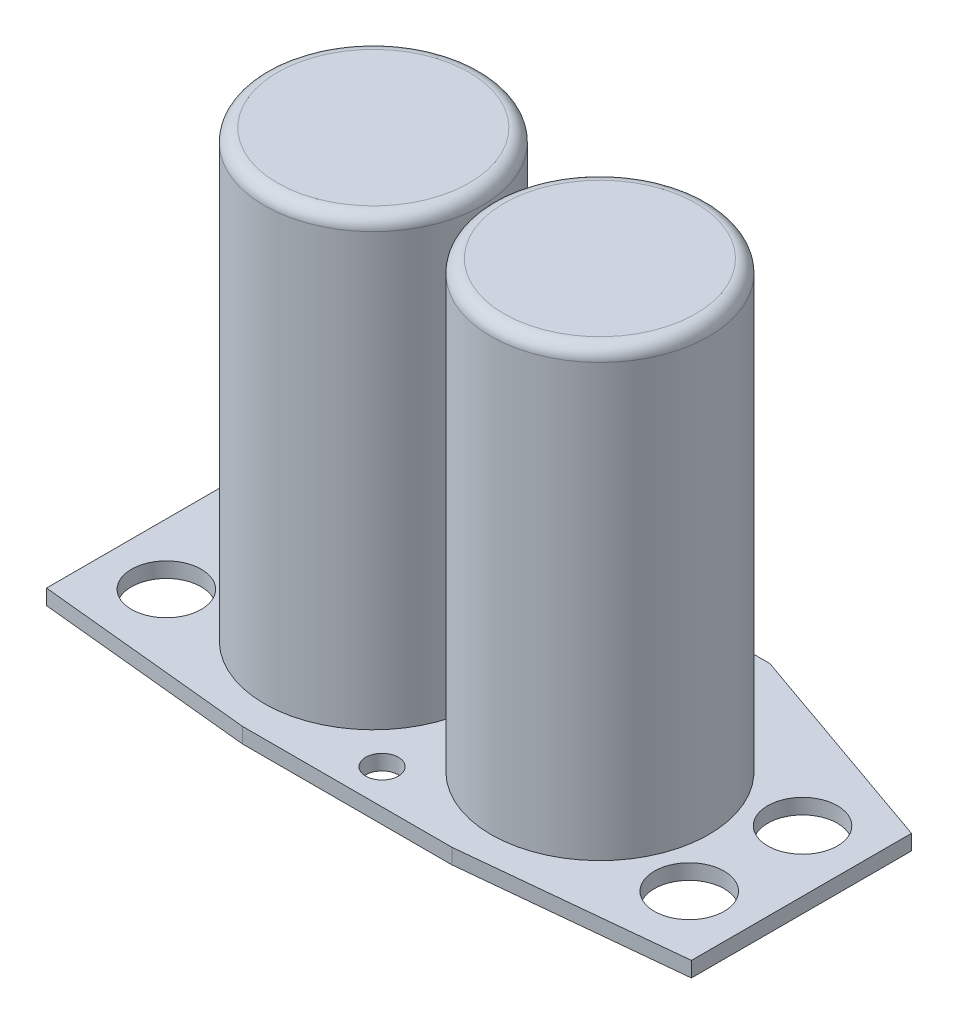
ISO-10303-21;
HEADER;
FILE_DESCRIPTION(('STEP AP214'),'2;1');
FILE_NAME('part.step','',(''),(''),'','','');
FILE_SCHEMA(('AUTOMOTIVE_DESIGN { 1 0 10303 214 1 1 1 1 }'));
ENDSEC;
DATA;
#1=APPLICATION_CONTEXT('core data for automotive mechanical design processes');
#2=APPLICATION_PROTOCOL_DEFINITION('international standard','automotive_design',2000,#1);
#3=PRODUCT_CONTEXT('',#1,'mechanical');
#4=PRODUCT('Part','Part','',(#3));
#5=PRODUCT_RELATED_PRODUCT_CATEGORY('part','',(#4));
#6=PRODUCT_DEFINITION_FORMATION('','',#4);
#7=PRODUCT_DEFINITION_CONTEXT('part definition',#1,'design');
#8=PRODUCT_DEFINITION('design','',#6,#7);
#9=PRODUCT_DEFINITION_SHAPE('','',#8);
#10=(LENGTH_UNIT() NAMED_UNIT(*) SI_UNIT(.MILLI.,.METRE.));
#11=(NAMED_UNIT(*) PLANE_ANGLE_UNIT() SI_UNIT($,.RADIAN.));
#12=(NAMED_UNIT(*) SI_UNIT($,.STERADIAN.) SOLID_ANGLE_UNIT());
#13=UNCERTAINTY_MEASURE_WITH_UNIT(LENGTH_MEASURE(1.E-05),#10,'distance_accuracy_value','');
#14=(GEOMETRIC_REPRESENTATION_CONTEXT(3) GLOBAL_UNCERTAINTY_ASSIGNED_CONTEXT((#13)) GLOBAL_UNIT_ASSIGNED_CONTEXT((#10,
#11,#12)) REPRESENTATION_CONTEXT('',''));
#15=CARTESIAN_POINT('',(0.,0.,0.));
#16=DIRECTION('',(0.,0.,1.));
#17=DIRECTION('',(1.,0.,0.));
#18=AXIS2_PLACEMENT_3D('',#15,#16,#17);
#19=CARTESIAN_POINT('',(8.49796881959911,0.889,-24.2799109131403));
#20=DIRECTION('',(-0.330350424728106,0.,0.943858356366018));
#21=DIRECTION('',(0.943858356366018,0.,0.330350424728106));
#22=AXIS2_PLACEMENT_3D('',#19,#20,#21);
#23=PLANE('',#22);
#24=DIRECTION('',(-0.943858356366018,0.,-0.330350424728106));
#25=VECTOR('',#24,1.);
#26=CARTESIAN_POINT('',(8.49796881959911,0.,-24.2799109131403));
#27=LINE('',#26,#25);
#28=CARTESIAN_POINT('',(37.592,0.,-14.097));
#29=VERTEX_POINT('',#28);
#30=CARTESIAN_POINT('',(24.892,0.,-18.542));
#31=VERTEX_POINT('',#30);
#32=EDGE_CURVE('E144',#29,#31,#27,.T.);
#33=ORIENTED_EDGE('',*,*,#32,.T.);
#34=DIRECTION('',(0.,-1.,0.));
#35=VECTOR('',#34,1.);
#36=CARTESIAN_POINT('',(24.892,0.889,-18.542));
#37=LINE('',#36,#35);
#38=CARTESIAN_POINT('',(24.892,0.889,-18.542));
#39=VERTEX_POINT('',#38);
#40=EDGE_CURVE('E179',#39,#31,#37,.T.);
#41=ORIENTED_EDGE('',*,*,#40,.F.);
#42=DIRECTION('',(-0.943858356366018,0.,-0.330350424728106));
#43=VECTOR('',#42,1.);
#44=CARTESIAN_POINT('',(8.49796881959911,0.889,-24.2799109131403));
#45=LINE('',#44,#43);
#46=CARTESIAN_POINT('',(37.592,0.889,-14.097));
#47=VERTEX_POINT('',#46);
#48=EDGE_CURVE('E91',#47,#39,#45,.T.);
#49=ORIENTED_EDGE('',*,*,#48,.F.);
#50=DIRECTION('',(0.,-1.,0.));
#51=VECTOR('',#50,1.);
#52=CARTESIAN_POINT('',(37.592,0.889,-14.097));
#53=LINE('',#52,#51);
#54=EDGE_CURVE('E140',#47,#29,#53,.T.);
#55=ORIENTED_EDGE('',*,*,#54,.T.);
#56=EDGE_LOOP('',(#33,#41,#49,#55));
#57=FACE_BOUND('',#56,.T.);
#58=ADVANCED_FACE('F37',(#57),#23,.F.);
#59=CARTESIAN_POINT('',(0.,0.889,-18.542));
#60=DIRECTION('',(0.,0.,-1.));
#61=DIRECTION('',(-1.,0.,0.));
#62=AXIS2_PLACEMENT_3D('',#59,#60,#61);
#63=PLANE('',#62);
#64=DIRECTION('',(1.,0.,0.));
#65=VECTOR('',#64,1.);
#66=CARTESIAN_POINT('',(0.,0.,-18.542));
#67=LINE('',#66,#65);
#68=CARTESIAN_POINT('',(12.7,0.,-18.542));
#69=VERTEX_POINT('',#68);
#70=EDGE_CURVE('E148',#69,#31,#67,.T.);
#71=ORIENTED_EDGE('',*,*,#70,.F.);
#72=DIRECTION('',(0.,-1.,0.));
#73=VECTOR('',#72,1.);
#74=CARTESIAN_POINT('',(12.7,0.889,-18.542));
#75=LINE('',#74,#73);
#76=CARTESIAN_POINT('',(12.7,0.889,-18.542));
#77=VERTEX_POINT('',#76);
#78=EDGE_CURVE('E177',#77,#69,#75,.T.);
#79=ORIENTED_EDGE('',*,*,#78,.F.);
#80=DIRECTION('',(1.,0.,0.));
#81=VECTOR('',#80,1.);
#82=CARTESIAN_POINT('',(0.,0.889,-18.542));
#83=LINE('',#82,#81);
#84=EDGE_CURVE('E274',#77,#39,#83,.T.);
#85=ORIENTED_EDGE('',*,*,#84,.T.);
#86=ORIENTED_EDGE('',*,*,#40,.T.);
#87=EDGE_LOOP('',(#71,#79,#85,#86));
#88=FACE_BOUND('',#87,.T.);
#89=ADVANCED_FACE('F201',(#88),#63,.T.);
#90=CARTESIAN_POINT('',(-4.39550111358575,0.889,-12.558574610245));
#91=DIRECTION('',(-0.330350424728106,0.,-0.943858356366018));
#92=DIRECTION('',(-0.943858356366018,0.,0.330350424728106));
#93=AXIS2_PLACEMENT_3D('',#90,#91,#92);
#94=PLANE('',#93);
#95=DIRECTION('',(0.943858356366018,0.,-0.330350424728106));
#96=VECTOR('',#95,1.);
#97=CARTESIAN_POINT('',(-4.39550111358575,0.,-12.558574610245));
#98=LINE('',#97,#96);
#99=CARTESIAN_POINT('',(0.,0.,-14.097));
#100=VERTEX_POINT('',#99);
#101=EDGE_CURVE('E151',#100,#69,#98,.T.);
#102=ORIENTED_EDGE('',*,*,#101,.F.);
#103=DIRECTION('',(0.,-1.,0.));
#104=VECTOR('',#103,1.);
#105=CARTESIAN_POINT('',(0.,0.889,-14.097));
#106=LINE('',#105,#104);
#107=CARTESIAN_POINT('',(0.,0.889,-14.097));
#108=VERTEX_POINT('',#107);
#109=EDGE_CURVE('E175',#108,#100,#106,.T.);
#110=ORIENTED_EDGE('',*,*,#109,.F.);
#111=DIRECTION('',(0.943858356366018,0.,-0.330350424728106));
#112=VECTOR('',#111,1.);
#113=CARTESIAN_POINT('',(-4.39550111358575,0.889,-12.558574610245));
#114=LINE('',#113,#112);
#115=EDGE_CURVE('E272',#108,#77,#114,.T.);
#116=ORIENTED_EDGE('',*,*,#115,.T.);
#117=ORIENTED_EDGE('',*,*,#78,.T.);
#118=EDGE_LOOP('',(#102,#110,#116,#117));
#119=FACE_BOUND('',#118,.T.);
#120=ADVANCED_FACE('F207',(#119),#94,.T.);
#121=CARTESIAN_POINT('',(0.,0.889,0.));
#122=DIRECTION('',(-1.,0.,0.));
#123=DIRECTION('',(0.,0.,1.));
#124=AXIS2_PLACEMENT_3D('',#121,#122,#123);
#125=PLANE('',#124);
#126=DIRECTION('',(0.,0.,-1.));
#127=VECTOR('',#126,1.);
#128=CARTESIAN_POINT('',(0.,0.,0.));
#129=LINE('',#128,#127);
#130=CARTESIAN_POINT('',(0.,0.,-1.27));
#131=VERTEX_POINT('',#130);
#132=EDGE_CURVE('E154',#131,#100,#129,.T.);
#133=ORIENTED_EDGE('',*,*,#132,.F.);
#134=DIRECTION('',(0.,-1.,0.));
#135=VECTOR('',#134,1.);
#136=CARTESIAN_POINT('',(0.,0.889,-1.27));
#137=LINE('',#136,#135);
#138=CARTESIAN_POINT('',(0.,0.889,-1.27));
#139=VERTEX_POINT('',#138);
#140=EDGE_CURVE('E173',#139,#131,#137,.T.);
#141=ORIENTED_EDGE('',*,*,#140,.F.);
#142=DIRECTION('',(0.,0.,-1.));
#143=VECTOR('',#142,1.);
#144=CARTESIAN_POINT('',(0.,0.889,0.));
#145=LINE('',#144,#143);
#146=EDGE_CURVE('E271',#139,#108,#145,.T.);
#147=ORIENTED_EDGE('',*,*,#146,.T.);
#148=ORIENTED_EDGE('',*,*,#109,.T.);
#149=EDGE_LOOP('',(#133,#141,#147,#148));
#150=FACE_BOUND('',#149,.T.);
#151=ADVANCED_FACE('F256',(#150),#125,.T.);
#152=CARTESIAN_POINT('',(0.125742574257426,0.889,-1.25742574257426));
#153=DIRECTION('',(0.0995037190209989,0.,-0.995037190209989));
#154=DIRECTION('',(-0.995037190209989,0.,-0.0995037190209989));
#155=AXIS2_PLACEMENT_3D('',#152,#153,#154);
#156=PLANE('',#155);
#157=DIRECTION('',(0.995037190209989,0.,0.0995037190209989));
#158=VECTOR('',#157,1.);
#159=CARTESIAN_POINT('',(0.125742574257426,0.,-1.25742574257426));
#160=LINE('',#159,#158);
#161=CARTESIAN_POINT('',(12.7,0.,0.));
#162=VERTEX_POINT('',#161);
#163=EDGE_CURVE('E157',#131,#162,#160,.T.);
#164=ORIENTED_EDGE('',*,*,#163,.T.);
#165=DIRECTION('',(0.,-1.,0.));
#166=VECTOR('',#165,1.);
#167=CARTESIAN_POINT('',(12.7,0.889,0.));
#168=LINE('',#167,#166);
#169=CARTESIAN_POINT('',(12.7,0.889,0.));
#170=VERTEX_POINT('',#169);
#171=EDGE_CURVE('E127',#170,#162,#168,.T.);
#172=ORIENTED_EDGE('',*,*,#171,.F.);
#173=DIRECTION('',(0.995037190209989,0.,0.0995037190209989));
#174=VECTOR('',#173,1.);
#175=CARTESIAN_POINT('',(0.125742574257426,0.889,-1.25742574257426));
#176=LINE('',#175,#174);
#177=EDGE_CURVE('E114',#139,#170,#176,.T.);
#178=ORIENTED_EDGE('',*,*,#177,.F.);
#179=ORIENTED_EDGE('',*,*,#140,.T.);
#180=EDGE_LOOP('',(#164,#172,#178,#179));
#181=FACE_BOUND('',#180,.T.);
#182=ADVANCED_FACE('F253',(#181),#156,.F.);
#183=CARTESIAN_POINT('',(0.,0.889,0.));
#184=DIRECTION('',(0.,0.,-1.));
#185=DIRECTION('',(-1.,0.,0.));
#186=AXIS2_PLACEMENT_3D('',#183,#184,#185);
#187=PLANE('',#186);
#188=DIRECTION('',(1.,0.,0.));
#189=VECTOR('',#188,1.);
#190=CARTESIAN_POINT('',(0.,0.,0.));
#191=LINE('',#190,#189);
#192=CARTESIAN_POINT('',(24.892,0.,0.));
#193=VERTEX_POINT('',#192);
#194=EDGE_CURVE('E123',#162,#193,#191,.T.);
#195=ORIENTED_EDGE('',*,*,#194,.T.);
#196=DIRECTION('',(0.,-1.,0.));
#197=VECTOR('',#196,1.);
#198=CARTESIAN_POINT('',(24.892,0.889,0.));
#199=LINE('',#198,#197);
#200=CARTESIAN_POINT('',(24.892,0.889,0.));
#201=VERTEX_POINT('',#200);
#202=EDGE_CURVE('E120',#201,#193,#199,.T.);
#203=ORIENTED_EDGE('',*,*,#202,.F.);
#204=DIRECTION('',(1.,0.,0.));
#205=VECTOR('',#204,1.);
#206=CARTESIAN_POINT('',(0.,0.889,0.));
#207=LINE('',#206,#205);
#208=EDGE_CURVE('E106',#170,#201,#207,.T.);
#209=ORIENTED_EDGE('',*,*,#208,.F.);
#210=ORIENTED_EDGE('',*,*,#171,.T.);
#211=EDGE_LOOP('',(#195,#203,#209,#210));
#212=FACE_BOUND('',#211,.T.);
#213=ADVANCED_FACE('F121',(#212),#187,.F.);
#214=CARTESIAN_POINT('',(0.246455445544555,0.889,2.46455445544555));
#215=DIRECTION('',(0.0995037190209989,0.,0.995037190209989));
#216=DIRECTION('',(0.995037190209989,0.,-0.0995037190209989));
#217=AXIS2_PLACEMENT_3D('',#214,#215,#216);
#218=PLANE('',#217);
#219=DIRECTION('',(-0.995037190209989,0.,0.0995037190209989));
#220=VECTOR('',#219,1.);
#221=CARTESIAN_POINT('',(0.246455445544555,0.,2.46455445544555));
#222=LINE('',#221,#220);
#223=CARTESIAN_POINT('',(37.592,0.,-1.27));
#224=VERTEX_POINT('',#223);
#225=EDGE_CURVE('E160',#224,#193,#222,.T.);
#226=ORIENTED_EDGE('',*,*,#225,.F.);
#227=DIRECTION('',(0.,-1.,0.));
#228=VECTOR('',#227,1.);
#229=CARTESIAN_POINT('',(37.592,0.889,-1.27));
#230=LINE('',#229,#228);
#231=CARTESIAN_POINT('',(37.592,0.889,-1.27));
#232=VERTEX_POINT('',#231);
#233=EDGE_CURVE('E82',#232,#224,#230,.T.);
#234=ORIENTED_EDGE('',*,*,#233,.F.);
#235=DIRECTION('',(-0.995037190209989,0.,0.0995037190209989));
#236=VECTOR('',#235,1.);
#237=CARTESIAN_POINT('',(0.246455445544555,0.889,2.46455445544555));
#238=LINE('',#237,#236);
#239=EDGE_CURVE('E111',#232,#201,#238,.T.);
#240=ORIENTED_EDGE('',*,*,#239,.T.);
#241=ORIENTED_EDGE('',*,*,#202,.T.);
#242=EDGE_LOOP('',(#226,#234,#240,#241));
#243=FACE_BOUND('',#242,.T.);
#244=ADVANCED_FACE('F129',(#243),#218,.T.);
#245=CARTESIAN_POINT('',(13.208,0.889,-16.51));
#246=DIRECTION('',(0.,-1.,0.));
#247=DIRECTION('',(0.,0.,-1.));
#248=AXIS2_PLACEMENT_3D('',#245,#246,#247);
#249=CYLINDRICAL_SURFACE('',#248,0.952500000000003);
#250=CARTESIAN_POINT('',(13.208,0.889,-16.51));
#251=DIRECTION('',(0.,1.,0.));
#252=DIRECTION('',(0.,0.,1.));
#253=AXIS2_PLACEMENT_3D('',#250,#251,#252);
#254=CIRCLE('',#253,0.952500000000003);
#255=CARTESIAN_POINT('',(13.208,0.889,-15.5575));
#256=VERTEX_POINT('',#255);
#257=EDGE_CURVE('E131',#256,#256,#254,.T.);
#258=ORIENTED_EDGE('',*,*,#257,.T.);
#259=EDGE_LOOP('',(#258));
#260=FACE_BOUND('',#259,.T.);
#261=CARTESIAN_POINT('',(13.208,0.,-16.51));
#262=DIRECTION('',(0.,1.,0.));
#263=DIRECTION('',(0.,0.,1.));
#264=AXIS2_PLACEMENT_3D('',#261,#262,#263);
#265=CIRCLE('',#264,0.952500000000003);
#266=CARTESIAN_POINT('',(13.208,0.,-15.5575));
#267=VERTEX_POINT('',#266);
#268=EDGE_CURVE('E163',#267,#267,#265,.T.);
#269=ORIENTED_EDGE('',*,*,#268,.F.);
#270=EDGE_LOOP('',(#269));
#271=FACE_BOUND('',#270,.T.);
#272=ADVANCED_FACE('F223',(#260,#271),#249,.F.);
#273=CARTESIAN_POINT('',(37.592,0.889,0.));
#274=DIRECTION('',(-1.,0.,0.));
#275=DIRECTION('',(0.,0.,1.));
#276=AXIS2_PLACEMENT_3D('',#273,#274,#275);
#277=PLANE('',#276);
#278=DIRECTION('',(0.,0.,-1.));
#279=VECTOR('',#278,1.);
#280=CARTESIAN_POINT('',(37.592,0.,0.));
#281=LINE('',#280,#279);
#282=EDGE_CURVE('E85',#224,#29,#281,.T.);
#283=ORIENTED_EDGE('',*,*,#282,.T.);
#284=ORIENTED_EDGE('',*,*,#54,.F.);
#285=DIRECTION('',(0.,0.,-1.));
#286=VECTOR('',#285,1.);
#287=CARTESIAN_POINT('',(37.592,0.889,0.));
#288=LINE('',#287,#286);
#289=EDGE_CURVE('E54',#232,#47,#288,.T.);
#290=ORIENTED_EDGE('',*,*,#289,.F.);
#291=ORIENTED_EDGE('',*,*,#233,.T.);
#292=EDGE_LOOP('',(#283,#284,#290,#291));
#293=FACE_BOUND('',#292,.T.);
#294=ADVANCED_FACE('F215',(#293),#277,.F.);
#295=CARTESIAN_POINT('',(18.796,0.889,-2.032));
#296=DIRECTION('',(0.,-1.,0.));
#297=DIRECTION('',(0.,0.,-1.));
#298=AXIS2_PLACEMENT_3D('',#295,#296,#297);
#299=CYLINDRICAL_SURFACE('',#298,0.9525);
#300=CARTESIAN_POINT('',(18.796,0.889,-2.032));
#301=DIRECTION('',(0.,1.,0.));
#302=DIRECTION('',(0.,0.,1.));
#303=AXIS2_PLACEMENT_3D('',#300,#301,#302);
#304=CIRCLE('',#303,0.9525);
#305=CARTESIAN_POINT('',(18.796,0.889,-1.0795));
#306=VERTEX_POINT('',#305);
#307=EDGE_CURVE('E169',#306,#306,#304,.T.);
#308=ORIENTED_EDGE('',*,*,#307,.T.);
#309=EDGE_LOOP('',(#308));
#310=FACE_BOUND('',#309,.T.);
#311=CARTESIAN_POINT('',(18.796,0.,-2.032));
#312=DIRECTION('',(0.,1.,0.));
#313=DIRECTION('',(0.,0.,1.));
#314=AXIS2_PLACEMENT_3D('',#311,#312,#313);
#315=CIRCLE('',#314,0.9525);
#316=CARTESIAN_POINT('',(18.796,0.,-1.0795));
#317=VERTEX_POINT('',#316);
#318=EDGE_CURVE('E141',#317,#317,#315,.T.);
#319=ORIENTED_EDGE('',*,*,#318,.F.);
#320=EDGE_LOOP('',(#319));
#321=FACE_BOUND('',#320,.T.);
#322=ADVANCED_FACE('F212',(#310,#321),#299,.F.);
#323=CARTESIAN_POINT('',(24.384,0.889,-16.51));
#324=DIRECTION('',(0.,-1.,0.));
#325=DIRECTION('',(0.,0.,-1.));
#326=AXIS2_PLACEMENT_3D('',#323,#324,#325);
#327=CYLINDRICAL_SURFACE('',#326,0.952500000000003);
#328=CARTESIAN_POINT('',(24.384,0.889,-16.51));
#329=DIRECTION('',(0.,1.,0.));
#330=DIRECTION('',(0.,0.,1.));
#331=AXIS2_PLACEMENT_3D('',#328,#329,#330);
#332=CIRCLE('',#331,0.952500000000003);
#333=CARTESIAN_POINT('',(24.384,0.889,-15.5575));
#334=VERTEX_POINT('',#333);
#335=EDGE_CURVE('E137',#334,#334,#332,.F.);
#336=ORIENTED_EDGE('',*,*,#335,.F.);
#337=EDGE_LOOP('',(#336));
#338=FACE_BOUND('',#337,.T.);
#339=CARTESIAN_POINT('',(24.384,0.,-16.51));
#340=DIRECTION('',(0.,1.,0.));
#341=DIRECTION('',(0.,0.,1.));
#342=AXIS2_PLACEMENT_3D('',#339,#340,#341);
#343=CIRCLE('',#342,0.952500000000003);
#344=CARTESIAN_POINT('',(24.384,0.,-15.5575));
#345=VERTEX_POINT('',#344);
#346=EDGE_CURVE('E166',#345,#345,#343,.F.);
#347=ORIENTED_EDGE('',*,*,#346,.T.);
#348=EDGE_LOOP('',(#347));
#349=FACE_BOUND('',#348,.T.);
#350=ADVANCED_FACE('F214',(#338,#349),#327,.F.);
#351=CARTESIAN_POINT('',(0.,0.889,0.));
#352=DIRECTION('',(0.,1.,0.));
#353=DIRECTION('',(0.,0.,1.));
#354=AXIS2_PLACEMENT_3D('',#351,#352,#353);
#355=PLANE('',#354);
#356=CARTESIAN_POINT('',(34.036,0.889,-11.303));
#357=DIRECTION('',(0.,1.,0.));
#358=DIRECTION('',(0.,0.,-1.));
#359=AXIS2_PLACEMENT_3D('',#356,#357,#358);
#360=CIRCLE('',#359,2.03199999999999);
#361=CARTESIAN_POINT('',(34.036,0.889,-13.335));
#362=VERTEX_POINT('',#361);
#363=EDGE_CURVE('E305',#362,#362,#360,.T.);
#364=ORIENTED_EDGE('',*,*,#363,.F.);
#365=EDGE_LOOP('',(#364));
#366=FACE_BOUND('',#365,.T.);
#367=CARTESIAN_POINT('',(34.036,0.889,-4.69900000000002));
#368=DIRECTION('',(0.,1.,0.));
#369=DIRECTION('',(0.,0.,-1.));
#370=AXIS2_PLACEMENT_3D('',#367,#368,#369);
#371=CIRCLE('',#370,2.032);
#372=CARTESIAN_POINT('',(34.036,0.889,-6.73100000000002));
#373=VERTEX_POINT('',#372);
#374=EDGE_CURVE('E299',#373,#373,#371,.T.);
#375=ORIENTED_EDGE('',*,*,#374,.F.);
#376=EDGE_LOOP('',(#375));
#377=FACE_BOUND('',#376,.T.);
#378=CARTESIAN_POINT('',(3.556,0.889,-4.699));
#379=DIRECTION('',(0.,1.,0.));
#380=DIRECTION('',(0.,0.,1.));
#381=AXIS2_PLACEMENT_3D('',#378,#379,#380);
#382=CIRCLE('',#381,2.032);
#383=CARTESIAN_POINT('',(3.556,0.889,-2.667));
#384=VERTEX_POINT('',#383);
#385=EDGE_CURVE('E293',#384,#384,#382,.T.);
#386=ORIENTED_EDGE('',*,*,#385,.F.);
#387=EDGE_LOOP('',(#386));
#388=FACE_BOUND('',#387,.T.);
#389=CARTESIAN_POINT('',(3.556,0.889,-11.303));
#390=DIRECTION('',(0.,1.,0.));
#391=DIRECTION('',(0.,0.,1.));
#392=AXIS2_PLACEMENT_3D('',#389,#390,#391);
#393=CIRCLE('',#392,2.032);
#394=CARTESIAN_POINT('',(3.556,0.889,-9.271));
#395=VERTEX_POINT('',#394);
#396=EDGE_CURVE('E287',#395,#395,#393,.T.);
#397=ORIENTED_EDGE('',*,*,#396,.F.);
#398=EDGE_LOOP('',(#397));
#399=FACE_BOUND('',#398,.T.);
#400=CARTESIAN_POINT('',(25.4,0.889,-8.12800000000001));
#401=DIRECTION('',(0.,1.,0.));
#402=DIRECTION('',(0.,0.,1.));
#403=AXIS2_PLACEMENT_3D('',#400,#401,#402);
#404=CIRCLE('',#403,6.35);
#405=CARTESIAN_POINT('',(25.4,0.889,-1.77800000000001));
#406=VERTEX_POINT('',#405);
#407=EDGE_CURVE('E283',#406,#406,#404,.T.);
#408=ORIENTED_EDGE('',*,*,#407,.F.);
#409=EDGE_LOOP('',(#408));
#410=FACE_BOUND('',#409,.T.);
#411=CARTESIAN_POINT('',(12.192,0.889,-8.128));
#412=DIRECTION('',(0.,1.,0.));
#413=DIRECTION('',(0.,0.,1.));
#414=AXIS2_PLACEMENT_3D('',#411,#412,#413);
#415=CIRCLE('',#414,6.35);
#416=CARTESIAN_POINT('',(12.192,0.889,-1.778));
#417=VERTEX_POINT('',#416);
#418=EDGE_CURVE('E145',#417,#417,#415,.T.);
#419=ORIENTED_EDGE('',*,*,#418,.F.);
#420=EDGE_LOOP('',(#419));
#421=FACE_BOUND('',#420,.T.);
#422=ORIENTED_EDGE('',*,*,#307,.F.);
#423=EDGE_LOOP('',(#422));
#424=FACE_BOUND('',#423,.T.);
#425=ORIENTED_EDGE('',*,*,#48,.T.);
#426=ORIENTED_EDGE('',*,*,#84,.F.);
#427=ORIENTED_EDGE('',*,*,#115,.F.);
#428=ORIENTED_EDGE('',*,*,#146,.F.);
#429=ORIENTED_EDGE('',*,*,#177,.T.);
#430=ORIENTED_EDGE('',*,*,#208,.T.);
#431=ORIENTED_EDGE('',*,*,#239,.F.);
#432=ORIENTED_EDGE('',*,*,#289,.T.);
#433=EDGE_LOOP('',(#425,#426,#427,#428,#429,#430,#431,#432));
#434=FACE_BOUND('',#433,.T.);
#435=ORIENTED_EDGE('',*,*,#257,.F.);
#436=EDGE_LOOP('',(#435));
#437=FACE_BOUND('',#436,.T.);
#438=ORIENTED_EDGE('',*,*,#335,.T.);
#439=EDGE_LOOP('',(#438));
#440=FACE_BOUND('',#439,.T.);
#441=ADVANCED_FACE('F108',(#366,#377,#388,#399,#410,#421,#424,#434,#437,#440),#355,.T.);
#442=CARTESIAN_POINT('',(0.,0.,0.));
#443=DIRECTION('',(0.,1.,0.));
#444=DIRECTION('',(0.,0.,1.));
#445=AXIS2_PLACEMENT_3D('',#442,#443,#444);
#446=PLANE('',#445);
#447=CARTESIAN_POINT('',(34.036,0.,-11.303));
#448=DIRECTION('',(0.,1.,0.));
#449=DIRECTION('',(0.,0.,-1.));
#450=AXIS2_PLACEMENT_3D('',#447,#448,#449);
#451=CIRCLE('',#450,2.03199999999999);
#452=CARTESIAN_POINT('',(34.036,0.,-13.335));
#453=VERTEX_POINT('',#452);
#454=EDGE_CURVE('E302',#453,#453,#451,.T.);
#455=ORIENTED_EDGE('',*,*,#454,.T.);
#456=EDGE_LOOP('',(#455));
#457=FACE_BOUND('',#456,.T.);
#458=CARTESIAN_POINT('',(34.036,0.,-4.69900000000002));
#459=DIRECTION('',(0.,1.,0.));
#460=DIRECTION('',(0.,0.,-1.));
#461=AXIS2_PLACEMENT_3D('',#458,#459,#460);
#462=CIRCLE('',#461,2.032);
#463=CARTESIAN_POINT('',(34.036,0.,-6.73100000000002));
#464=VERTEX_POINT('',#463);
#465=EDGE_CURVE('E296',#464,#464,#462,.T.);
#466=ORIENTED_EDGE('',*,*,#465,.T.);
#467=EDGE_LOOP('',(#466));
#468=FACE_BOUND('',#467,.T.);
#469=CARTESIAN_POINT('',(3.556,0.,-4.699));
#470=DIRECTION('',(0.,1.,0.));
#471=DIRECTION('',(0.,0.,1.));
#472=AXIS2_PLACEMENT_3D('',#469,#470,#471);
#473=CIRCLE('',#472,2.032);
#474=CARTESIAN_POINT('',(3.556,0.,-2.667));
#475=VERTEX_POINT('',#474);
#476=EDGE_CURVE('E290',#475,#475,#473,.T.);
#477=ORIENTED_EDGE('',*,*,#476,.T.);
#478=EDGE_LOOP('',(#477));
#479=FACE_BOUND('',#478,.T.);
#480=CARTESIAN_POINT('',(3.556,0.,-11.303));
#481=DIRECTION('',(0.,1.,0.));
#482=DIRECTION('',(0.,0.,1.));
#483=AXIS2_PLACEMENT_3D('',#480,#481,#482);
#484=CIRCLE('',#483,2.032);
#485=CARTESIAN_POINT('',(3.556,0.,-9.271));
#486=VERTEX_POINT('',#485);
#487=EDGE_CURVE('E286',#486,#486,#484,.T.);
#488=ORIENTED_EDGE('',*,*,#487,.T.);
#489=EDGE_LOOP('',(#488));
#490=FACE_BOUND('',#489,.T.);
#491=ORIENTED_EDGE('',*,*,#318,.T.);
#492=EDGE_LOOP('',(#491));
#493=FACE_BOUND('',#492,.T.);
#494=ORIENTED_EDGE('',*,*,#32,.F.);
#495=ORIENTED_EDGE('',*,*,#282,.F.);
#496=ORIENTED_EDGE('',*,*,#225,.T.);
#497=ORIENTED_EDGE('',*,*,#194,.F.);
#498=ORIENTED_EDGE('',*,*,#163,.F.);
#499=ORIENTED_EDGE('',*,*,#132,.T.);
#500=ORIENTED_EDGE('',*,*,#101,.T.);
#501=ORIENTED_EDGE('',*,*,#70,.T.);
#502=EDGE_LOOP('',(#494,#495,#496,#497,#498,#499,#500,#501));
#503=FACE_BOUND('',#502,.T.);
#504=ORIENTED_EDGE('',*,*,#268,.T.);
#505=EDGE_LOOP('',(#504));
#506=FACE_BOUND('',#505,.T.);
#507=ORIENTED_EDGE('',*,*,#346,.F.);
#508=EDGE_LOOP('',(#507));
#509=FACE_BOUND('',#508,.T.);
#510=ADVANCED_FACE('F230',(#457,#468,#479,#490,#493,#503,#506,#509),#446,.F.);
#511=CARTESIAN_POINT('',(12.192,26.797,-8.128));
#512=DIRECTION('',(0.,-1.,0.));
#513=DIRECTION('',(0.,0.,-1.));
#514=AXIS2_PLACEMENT_3D('',#511,#512,#513);
#515=CYLINDRICAL_SURFACE('',#514,6.35);
#516=CARTESIAN_POINT('',(12.192,26.035,-8.128));
#517=DIRECTION('',(0.,1.,0.));
#518=DIRECTION('',(0.,0.,1.));
#519=AXIS2_PLACEMENT_3D('',#516,#517,#518);
#520=CIRCLE('',#519,6.35);
#521=CARTESIAN_POINT('',(12.192,26.035,-1.778));
#522=VERTEX_POINT('',#521);
#523=EDGE_CURVE('E11',#522,#522,#520,.F.);
#524=ORIENTED_EDGE('',*,*,#523,.T.);
#525=EDGE_LOOP('',(#524));
#526=FACE_BOUND('',#525,.T.);
#527=ORIENTED_EDGE('',*,*,#418,.T.);
#528=EDGE_LOOP('',(#527));
#529=FACE_BOUND('',#528,.T.);
#530=ADVANCED_FACE('F233',(#526,#529),#515,.T.);
#531=CARTESIAN_POINT('',(12.192,26.797,-8.128));
#532=DIRECTION('',(0.,1.,0.));
#533=DIRECTION('',(0.,0.,1.));
#534=AXIS2_PLACEMENT_3D('',#531,#532,#533);
#535=PLANE('',#534);
#536=CARTESIAN_POINT('',(12.192,26.797,-8.128));
#537=DIRECTION('',(0.,1.,0.));
#538=DIRECTION('',(0.,0.,1.));
#539=AXIS2_PLACEMENT_3D('',#536,#537,#538);
#540=CIRCLE('',#539,5.588);
#541=CARTESIAN_POINT('',(12.192,26.797,-2.54));
#542=VERTEX_POINT('',#541);
#543=EDGE_CURVE('E46',#542,#542,#540,.T.);
#544=ORIENTED_EDGE('',*,*,#543,.T.);
#545=EDGE_LOOP('',(#544));
#546=FACE_BOUND('',#545,.T.);
#547=ADVANCED_FACE('F189',(#546),#535,.T.);
#548=CARTESIAN_POINT('',(25.4,26.797,-8.12800000000001));
#549=DIRECTION('',(0.,-1.,0.));
#550=DIRECTION('',(0.,0.,-1.));
#551=AXIS2_PLACEMENT_3D('',#548,#549,#550);
#552=CYLINDRICAL_SURFACE('',#551,6.35);
#553=CARTESIAN_POINT('',(25.4,26.035,-8.12800000000001));
#554=DIRECTION('',(0.,1.,0.));
#555=DIRECTION('',(0.,0.,1.));
#556=AXIS2_PLACEMENT_3D('',#553,#554,#555);
#557=CIRCLE('',#556,6.35);
#558=CARTESIAN_POINT('',(25.4,26.035,-1.77800000000001));
#559=VERTEX_POINT('',#558);
#560=EDGE_CURVE('E184',#559,#559,#557,.F.);
#561=ORIENTED_EDGE('',*,*,#560,.T.);
#562=EDGE_LOOP('',(#561));
#563=FACE_BOUND('',#562,.T.);
#564=ORIENTED_EDGE('',*,*,#407,.T.);
#565=EDGE_LOOP('',(#564));
#566=FACE_BOUND('',#565,.T.);
#567=ADVANCED_FACE('F338',(#563,#566),#552,.T.);
#568=CARTESIAN_POINT('',(25.4,26.797,-8.12800000000001));
#569=DIRECTION('',(0.,1.,0.));
#570=DIRECTION('',(0.,0.,1.));
#571=AXIS2_PLACEMENT_3D('',#568,#569,#570);
#572=PLANE('',#571);
#573=CARTESIAN_POINT('',(25.4,26.797,-8.12800000000001));
#574=DIRECTION('',(0.,1.,0.));
#575=DIRECTION('',(0.,0.,1.));
#576=AXIS2_PLACEMENT_3D('',#573,#574,#575);
#577=CIRCLE('',#576,5.588);
#578=CARTESIAN_POINT('',(25.4,26.797,-2.54000000000001));
#579=VERTEX_POINT('',#578);
#580=EDGE_CURVE('E181',#579,#579,#577,.T.);
#581=ORIENTED_EDGE('',*,*,#580,.T.);
#582=EDGE_LOOP('',(#581));
#583=FACE_BOUND('',#582,.T.);
#584=ADVANCED_FACE('F343',(#583),#572,.T.);
#585=CARTESIAN_POINT('',(3.556,0.,-11.303));
#586=DIRECTION('',(0.,1.,0.));
#587=DIRECTION('',(0.,0.,1.));
#588=AXIS2_PLACEMENT_3D('',#585,#586,#587);
#589=CYLINDRICAL_SURFACE('',#588,2.032);
#590=ORIENTED_EDGE('',*,*,#487,.F.);
#591=EDGE_LOOP('',(#590));
#592=FACE_BOUND('',#591,.T.);
#593=ORIENTED_EDGE('',*,*,#396,.T.);
#594=EDGE_LOOP('',(#593));
#595=FACE_BOUND('',#594,.T.);
#596=ADVANCED_FACE('F347',(#592,#595),#589,.F.);
#597=CARTESIAN_POINT('',(3.556,0.,-4.699));
#598=DIRECTION('',(0.,1.,0.));
#599=DIRECTION('',(0.,0.,1.));
#600=AXIS2_PLACEMENT_3D('',#597,#598,#599);
#601=CYLINDRICAL_SURFACE('',#600,2.032);
#602=ORIENTED_EDGE('',*,*,#476,.F.);
#603=EDGE_LOOP('',(#602));
#604=FACE_BOUND('',#603,.T.);
#605=ORIENTED_EDGE('',*,*,#385,.T.);
#606=EDGE_LOOP('',(#605));
#607=FACE_BOUND('',#606,.T.);
#608=ADVANCED_FACE('F351',(#604,#607),#601,.F.);
#609=CARTESIAN_POINT('',(34.036,0.,-4.69900000000002));
#610=DIRECTION('',(0.,1.,0.));
#611=DIRECTION('',(0.,0.,1.));
#612=AXIS2_PLACEMENT_3D('',#609,#610,#611);
#613=CYLINDRICAL_SURFACE('',#612,2.032);
#614=ORIENTED_EDGE('',*,*,#465,.F.);
#615=EDGE_LOOP('',(#614));
#616=FACE_BOUND('',#615,.T.);
#617=ORIENTED_EDGE('',*,*,#374,.T.);
#618=EDGE_LOOP('',(#617));
#619=FACE_BOUND('',#618,.T.);
#620=ADVANCED_FACE('F314',(#616,#619),#613,.F.);
#621=CARTESIAN_POINT('',(34.036,0.,-11.303));
#622=DIRECTION('',(0.,1.,0.));
#623=DIRECTION('',(0.,0.,1.));
#624=AXIS2_PLACEMENT_3D('',#621,#622,#623);
#625=CYLINDRICAL_SURFACE('',#624,2.03199999999999);
#626=ORIENTED_EDGE('',*,*,#454,.F.);
#627=EDGE_LOOP('',(#626));
#628=FACE_BOUND('',#627,.T.);
#629=ORIENTED_EDGE('',*,*,#363,.T.);
#630=EDGE_LOOP('',(#629));
#631=FACE_BOUND('',#630,.T.);
#632=ADVANCED_FACE('F197',(#628,#631),#625,.F.);
#633=CARTESIAN_POINT('',(25.4,26.035,-8.12800000000001));
#634=DIRECTION('',(0.,1.,0.));
#635=DIRECTION('',(0.,0.,1.));
#636=AXIS2_PLACEMENT_3D('',#633,#634,#635);
#637=TOROIDAL_SURFACE('',#636,5.588,0.762);
#638=ORIENTED_EDGE('',*,*,#560,.F.);
#639=EDGE_LOOP('',(#638));
#640=FACE_BOUND('',#639,.T.);
#641=ORIENTED_EDGE('',*,*,#580,.F.);
#642=EDGE_LOOP('',(#641));
#643=FACE_BOUND('',#642,.T.);
#644=ADVANCED_FACE('F192',(#640,#643),#637,.T.);
#645=CARTESIAN_POINT('',(12.192,26.035,-8.128));
#646=DIRECTION('',(0.,1.,0.));
#647=DIRECTION('',(0.,0.,1.));
#648=AXIS2_PLACEMENT_3D('',#645,#646,#647);
#649=TOROIDAL_SURFACE('',#648,5.588,0.762);
#650=ORIENTED_EDGE('',*,*,#523,.F.);
#651=EDGE_LOOP('',(#650));
#652=FACE_BOUND('',#651,.T.);
#653=ORIENTED_EDGE('',*,*,#543,.F.);
#654=EDGE_LOOP('',(#653));
#655=FACE_BOUND('',#654,.T.);
#656=ADVANCED_FACE('F39',(#652,#655),#649,.T.);
#657=CLOSED_SHELL('',(#58,#89,#120,#151,#182,#213,#244,#272,#294,#322,#350,#441,#510,#530,#547,
#567,#584,#596,#608,#620,#632,#644,#656));
#658=MANIFOLD_SOLID_BREP('B2',#657);
#659=ADVANCED_BREP_SHAPE_REPRESENTATION('',(#18,#658),#14);
#660=SHAPE_DEFINITION_REPRESENTATION(#9,#659);
ENDSEC;
END-ISO-10303-21;
